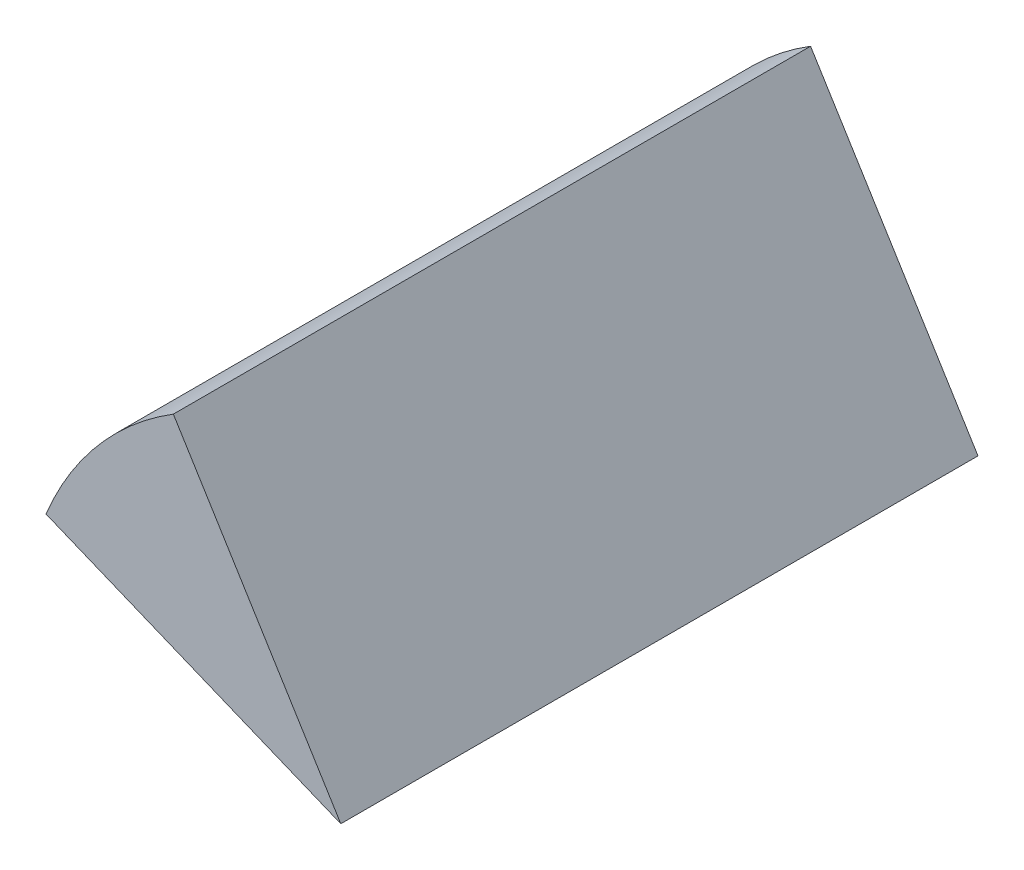
ISO-10303-21;
HEADER;
FILE_DESCRIPTION(('STEP AP214'),'2;1');
FILE_NAME('part.step','',(''),(''),'','','');
FILE_SCHEMA(('AUTOMOTIVE_DESIGN { 1 0 10303 214 1 1 1 1 }'));
ENDSEC;
DATA;
#1=APPLICATION_CONTEXT('core data for automotive mechanical design processes');
#2=APPLICATION_PROTOCOL_DEFINITION('international standard','automotive_design',2000,#1);
#3=PRODUCT_CONTEXT('',#1,'mechanical');
#4=PRODUCT('Part','Part','',(#3));
#5=PRODUCT_RELATED_PRODUCT_CATEGORY('part','',(#4));
#6=PRODUCT_DEFINITION_FORMATION('','',#4);
#7=PRODUCT_DEFINITION_CONTEXT('part definition',#1,'design');
#8=PRODUCT_DEFINITION('design','',#6,#7);
#9=PRODUCT_DEFINITION_SHAPE('','',#8);
#10=(LENGTH_UNIT() NAMED_UNIT(*) SI_UNIT(.MILLI.,.METRE.));
#11=(NAMED_UNIT(*) PLANE_ANGLE_UNIT() SI_UNIT($,.RADIAN.));
#12=(NAMED_UNIT(*) SI_UNIT($,.STERADIAN.) SOLID_ANGLE_UNIT());
#13=UNCERTAINTY_MEASURE_WITH_UNIT(LENGTH_MEASURE(1.E-05),#10,'distance_accuracy_value','');
#14=(GEOMETRIC_REPRESENTATION_CONTEXT(3) GLOBAL_UNCERTAINTY_ASSIGNED_CONTEXT((#13)) GLOBAL_UNIT_ASSIGNED_CONTEXT((#10,
#11,#12)) REPRESENTATION_CONTEXT('',''));
#15=CARTESIAN_POINT('',(0.,0.,0.));
#16=DIRECTION('',(0.,0.,1.));
#17=DIRECTION('',(1.,0.,0.));
#18=AXIS2_PLACEMENT_3D('',#15,#16,#17);
#19=CARTESIAN_POINT('',(0.,0.,50.));
#20=DIRECTION('',(0.379422077713237,0.925223695623804,0.));
#21=DIRECTION('',(-0.925223695623804,0.379422077713237,0.));
#22=AXIS2_PLACEMENT_3D('',#19,#20,#21);
#23=PLANE('',#22);
#24=DIRECTION('',(0.925223695623804,-0.379422077713237,0.));
#25=VECTOR('',#24,1.);
#26=CARTESIAN_POINT('',(0.,0.,0.));
#27=LINE('',#26,#25);
#28=CARTESIAN_POINT('',(-23.1305923905951,9.48555194283093,0.));
#29=VERTEX_POINT('',#28);
#30=CARTESIAN_POINT('',(0.,0.,0.));
#31=VERTEX_POINT('',#30);
#32=EDGE_CURVE('E80',#29,#31,#27,.T.);
#33=ORIENTED_EDGE('',*,*,#32,.T.);
#34=DIRECTION('',(0.,0.,-1.));
#35=VECTOR('',#34,1.);
#36=CARTESIAN_POINT('',(0.,0.,50.));
#37=LINE('',#36,#35);
#38=CARTESIAN_POINT('',(0.,0.,50.));
#39=VERTEX_POINT('',#38);
#40=EDGE_CURVE('E11',#39,#31,#37,.T.);
#41=ORIENTED_EDGE('',*,*,#40,.F.);
#42=DIRECTION('',(0.925223695623804,-0.379422077713237,0.));
#43=VECTOR('',#42,1.);
#44=CARTESIAN_POINT('',(0.,0.,50.));
#45=LINE('',#44,#43);
#46=CARTESIAN_POINT('',(-23.1305923905951,9.48555194283093,50.));
#47=VERTEX_POINT('',#46);
#48=EDGE_CURVE('E73',#47,#39,#45,.T.);
#49=ORIENTED_EDGE('',*,*,#48,.F.);
#50=DIRECTION('',(0.,0.,-1.));
#51=VECTOR('',#50,1.);
#52=CARTESIAN_POINT('',(-23.1305923905951,9.48555194283093,50.));
#53=LINE('',#52,#51);
#54=EDGE_CURVE('E81',#47,#29,#53,.T.);
#55=ORIENTED_EDGE('',*,*,#54,.T.);
#56=EDGE_LOOP('',(#33,#41,#49,#55));
#57=FACE_BOUND('',#56,.T.);
#58=ADVANCED_FACE('F33',(#57),#23,.F.);
#59=CARTESIAN_POINT('',(0.,0.,50.));
#60=DIRECTION('',(-0.850791752270274,-0.525502991684041,0.));
#61=DIRECTION('',(0.525502991684041,-0.850791752270274,0.));
#62=AXIS2_PLACEMENT_3D('',#59,#60,#61);
#63=PLANE('',#62);
#64=DIRECTION('',(-0.525502991684041,0.850791752270274,0.));
#65=VECTOR('',#64,1.);
#66=CARTESIAN_POINT('',(0.,0.,0.));
#67=LINE('',#66,#65);
#68=CARTESIAN_POINT('',(-13.137574792101,21.2697938067569,0.));
#69=VERTEX_POINT('',#68);
#70=EDGE_CURVE('E61',#31,#69,#67,.T.);
#71=ORIENTED_EDGE('',*,*,#70,.T.);
#72=DIRECTION('',(0.,0.,-1.));
#73=VECTOR('',#72,1.);
#74=CARTESIAN_POINT('',(-13.137574792101,21.2697938067569,50.));
#75=LINE('',#74,#73);
#76=CARTESIAN_POINT('',(-13.137574792101,21.2697938067569,50.));
#77=VERTEX_POINT('',#76);
#78=EDGE_CURVE('E41',#77,#69,#75,.T.);
#79=ORIENTED_EDGE('',*,*,#78,.F.);
#80=DIRECTION('',(-0.525502991684041,0.850791752270274,0.));
#81=VECTOR('',#80,1.);
#82=CARTESIAN_POINT('',(0.,0.,50.));
#83=LINE('',#82,#81);
#84=EDGE_CURVE('E69',#39,#77,#83,.T.);
#85=ORIENTED_EDGE('',*,*,#84,.F.);
#86=ORIENTED_EDGE('',*,*,#40,.T.);
#87=EDGE_LOOP('',(#71,#79,#85,#86));
#88=FACE_BOUND('',#87,.T.);
#89=ADVANCED_FACE('F70',(#88),#63,.F.);
#90=CARTESIAN_POINT('',(0.,0.,50.));
#91=DIRECTION('',(0.,0.,-1.));
#92=DIRECTION('',(-1.,0.,0.));
#93=AXIS2_PLACEMENT_3D('',#90,#91,#92);
#94=CYLINDRICAL_SURFACE('',#93,25.);
#95=CARTESIAN_POINT('',(0.,0.,0.));
#96=DIRECTION('',(0.,0.,1.));
#97=DIRECTION('',(1.,0.,0.));
#98=AXIS2_PLACEMENT_3D('',#95,#96,#97);
#99=CIRCLE('',#98,25.);
#100=EDGE_CURVE('E66',#69,#29,#99,.T.);
#101=ORIENTED_EDGE('',*,*,#100,.T.);
#102=ORIENTED_EDGE('',*,*,#54,.F.);
#103=CARTESIAN_POINT('',(0.,0.,50.));
#104=DIRECTION('',(0.,0.,1.));
#105=DIRECTION('',(1.,0.,0.));
#106=AXIS2_PLACEMENT_3D('',#103,#104,#105);
#107=CIRCLE('',#106,25.);
#108=EDGE_CURVE('E49',#77,#47,#107,.T.);
#109=ORIENTED_EDGE('',*,*,#108,.F.);
#110=ORIENTED_EDGE('',*,*,#78,.T.);
#111=EDGE_LOOP('',(#101,#102,#109,#110));
#112=FACE_BOUND('',#111,.T.);
#113=ADVANCED_FACE('F92',(#112),#94,.T.);
#114=CARTESIAN_POINT('',(0.,0.,50.));
#115=DIRECTION('',(0.,0.,1.));
#116=DIRECTION('',(1.,0.,0.));
#117=AXIS2_PLACEMENT_3D('',#114,#115,#116);
#118=PLANE('',#117);
#119=ORIENTED_EDGE('',*,*,#48,.T.);
#120=ORIENTED_EDGE('',*,*,#84,.T.);
#121=ORIENTED_EDGE('',*,*,#108,.T.);
#122=EDGE_LOOP('',(#119,#120,#121));
#123=FACE_BOUND('',#122,.T.);
#124=ADVANCED_FACE('F76',(#123),#118,.T.);
#125=CARTESIAN_POINT('',(0.,0.,0.));
#126=DIRECTION('',(0.,0.,1.));
#127=DIRECTION('',(1.,0.,0.));
#128=AXIS2_PLACEMENT_3D('',#125,#126,#127);
#129=PLANE('',#128);
#130=CARTESIAN_POINT('',(-14.3810205699697,12.1722176826536,0.));
#131=DIRECTION('',(0.,0.,-1.));
#132=DIRECTION('',(-1.,0.,0.));
#133=AXIS2_PLACEMENT_3D('',#130,#131,#132);
#134=CIRCLE('',#133,5.);
#135=CARTESIAN_POINT('',(-19.3810205699697,12.1722176826536,0.));
#136=VERTEX_POINT('',#135);
#137=EDGE_CURVE('E87',#136,#136,#134,.T.);
#138=ORIENTED_EDGE('',*,*,#137,.F.);
#139=EDGE_LOOP('',(#138));
#140=FACE_BOUND('',#139,.T.);
#141=ORIENTED_EDGE('',*,*,#32,.F.);
#142=ORIENTED_EDGE('',*,*,#100,.F.);
#143=ORIENTED_EDGE('',*,*,#70,.F.);
#144=EDGE_LOOP('',(#141,#142,#143));
#145=FACE_BOUND('',#144,.T.);
#146=ADVANCED_FACE('F93',(#140,#145),#129,.F.);
#147=CARTESIAN_POINT('',(-14.3810205699697,12.1722176826536,10.));
#148=DIRECTION('',(0.,0.,-1.));
#149=DIRECTION('',(-1.,0.,0.));
#150=AXIS2_PLACEMENT_3D('',#147,#148,#149);
#151=CYLINDRICAL_SURFACE('',#150,5.);
#152=CARTESIAN_POINT('',(-14.3810205699697,12.1722176826536,10.));
#153=DIRECTION('',(0.,0.,-1.));
#154=DIRECTION('',(-1.,0.,0.));
#155=AXIS2_PLACEMENT_3D('',#152,#153,#154);
#156=CIRCLE('',#155,5.);
#157=CARTESIAN_POINT('',(-19.3810205699697,12.1722176826536,10.));
#158=VERTEX_POINT('',#157);
#159=EDGE_CURVE('E83',#158,#158,#156,.T.);
#160=ORIENTED_EDGE('',*,*,#159,.F.);
#161=EDGE_LOOP('',(#160));
#162=FACE_BOUND('',#161,.T.);
#163=ORIENTED_EDGE('',*,*,#137,.T.);
#164=EDGE_LOOP('',(#163));
#165=FACE_BOUND('',#164,.T.);
#166=ADVANCED_FACE('F95',(#162,#165),#151,.F.);
#167=CARTESIAN_POINT('',(-14.3810205699697,12.1722176826536,10.));
#168=DIRECTION('',(0.,0.,-1.));
#169=DIRECTION('',(-1.,0.,0.));
#170=AXIS2_PLACEMENT_3D('',#167,#168,#169);
#171=PLANE('',#170);
#172=ORIENTED_EDGE('',*,*,#159,.T.);
#173=EDGE_LOOP('',(#172));
#174=FACE_BOUND('',#173,.T.);
#175=ADVANCED_FACE('F102',(#174),#171,.T.);
#176=CLOSED_SHELL('',(#58,#89,#113,#124,#146,#166,#175));
#177=MANIFOLD_SOLID_BREP('B2',#176);
#178=ADVANCED_BREP_SHAPE_REPRESENTATION('',(#18,#177),#14);
#179=SHAPE_DEFINITION_REPRESENTATION(#9,#178);
ENDSEC;
END-ISO-10303-21;
